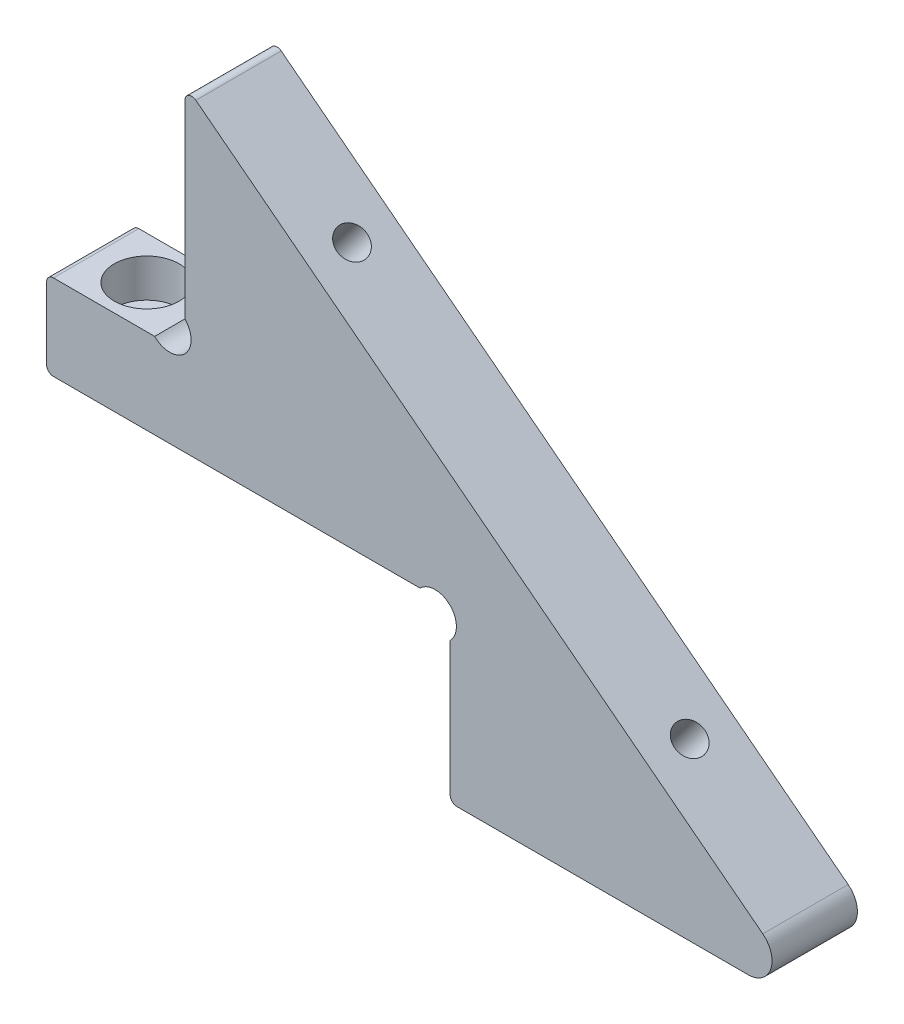
ISO-10303-21;
HEADER;
FILE_DESCRIPTION(('STEP AP214'),'2;1');
FILE_NAME('part.step','',(''),(''),'','','');
FILE_SCHEMA(('AUTOMOTIVE_DESIGN { 1 0 10303 214 1 1 1 1 }'));
ENDSEC;
DATA;
#1=APPLICATION_CONTEXT('core data for automotive mechanical design processes');
#2=APPLICATION_PROTOCOL_DEFINITION('international standard','automotive_design',2000,#1);
#3=PRODUCT_CONTEXT('',#1,'mechanical');
#4=PRODUCT('Part','Part','',(#3));
#5=PRODUCT_RELATED_PRODUCT_CATEGORY('part','',(#4));
#6=PRODUCT_DEFINITION_FORMATION('','',#4);
#7=PRODUCT_DEFINITION_CONTEXT('part definition',#1,'design');
#8=PRODUCT_DEFINITION('design','',#6,#7);
#9=PRODUCT_DEFINITION_SHAPE('','',#8);
#10=(LENGTH_UNIT() NAMED_UNIT(*) SI_UNIT(.MILLI.,.METRE.));
#11=(NAMED_UNIT(*) PLANE_ANGLE_UNIT() SI_UNIT($,.RADIAN.));
#12=(NAMED_UNIT(*) SI_UNIT($,.STERADIAN.) SOLID_ANGLE_UNIT());
#13=UNCERTAINTY_MEASURE_WITH_UNIT(LENGTH_MEASURE(1.E-05),#10,'distance_accuracy_value','');
#14=(GEOMETRIC_REPRESENTATION_CONTEXT(3) GLOBAL_UNCERTAINTY_ASSIGNED_CONTEXT((#13)) GLOBAL_UNIT_ASSIGNED_CONTEXT((#10,
#11,#12)) REPRESENTATION_CONTEXT('',''));
#15=CARTESIAN_POINT('',(0.,0.,0.));
#16=DIRECTION('',(0.,0.,1.));
#17=DIRECTION('',(1.,0.,0.));
#18=AXIS2_PLACEMENT_3D('',#15,#16,#17);
#19=CARTESIAN_POINT('',(-660.683227297424,63.424072949776,6.35));
#20=DIRECTION('',(1.,0.,0.));
#21=DIRECTION('',(0.,0.,-1.));
#22=AXIS2_PLACEMENT_3D('',#19,#20,#21);
#23=PLANE('',#22);
#24=DIRECTION('',(0.,-1.,0.));
#25=VECTOR('',#24,1.);
#26=CARTESIAN_POINT('',(-660.683227297424,63.424072949776,0.));
#27=LINE('',#26,#25);
#28=CARTESIAN_POINT('',(-660.683227297424,73.8789796725458,0.));
#29=VERTEX_POINT('',#28);
#30=CARTESIAN_POINT('',(-660.683227297424,63.932072949776,0.));
#31=VERTEX_POINT('',#30);
#32=EDGE_CURVE('E197',#29,#31,#27,.T.);
#33=ORIENTED_EDGE('',*,*,#32,.T.);
#34=DIRECTION('',(0.,0.,-1.));
#35=VECTOR('',#34,1.);
#36=CARTESIAN_POINT('',(-660.683227297424,63.932072949776,6.35));
#37=LINE('',#36,#35);
#38=CARTESIAN_POINT('',(-660.683227297424,63.932072949776,6.35));
#39=VERTEX_POINT('',#38);
#40=EDGE_CURVE('E247',#31,#39,#37,.F.);
#41=ORIENTED_EDGE('',*,*,#40,.T.);
#42=DIRECTION('',(0.,-1.,0.));
#43=VECTOR('',#42,1.);
#44=CARTESIAN_POINT('',(-660.683227297424,63.424072949776,6.35));
#45=LINE('',#44,#43);
#46=CARTESIAN_POINT('',(-660.683227297424,73.8789796725458,6.35));
#47=VERTEX_POINT('',#46);
#48=EDGE_CURVE('E172',#47,#39,#45,.T.);
#49=ORIENTED_EDGE('',*,*,#48,.F.);
#50=DIRECTION('',(0.,0.,-1.));
#51=VECTOR('',#50,1.);
#52=CARTESIAN_POINT('',(-660.683227297424,73.8789796725458,6.35));
#53=LINE('',#52,#51);
#54=EDGE_CURVE('E196',#47,#29,#53,.T.);
#55=ORIENTED_EDGE('',*,*,#54,.T.);
#56=EDGE_LOOP('',(#33,#41,#49,#55));
#57=FACE_BOUND('',#56,.T.);
#58=ADVANCED_FACE('F35',(#57),#23,.F.);
#59=CARTESIAN_POINT('',(-660.683227297424,63.424072949776,6.35));
#60=DIRECTION('',(0.,1.,0.));
#61=DIRECTION('',(0.,0.,1.));
#62=AXIS2_PLACEMENT_3D('',#59,#60,#61);
#63=PLANE('',#62);
#64=DIRECTION('',(1.,0.,0.));
#65=VECTOR('',#64,1.);
#66=CARTESIAN_POINT('',(-660.683227297424,63.424072949776,6.35));
#67=LINE('',#66,#65);
#68=CARTESIAN_POINT('',(-660.175227297424,63.424072949776,6.35));
#69=VERTEX_POINT('',#68);
#70=CARTESIAN_POINT('',(-638.517578145105,63.424072949776,6.35));
#71=VERTEX_POINT('',#70);
#72=EDGE_CURVE('E175',#69,#71,#67,.T.);
#73=ORIENTED_EDGE('',*,*,#72,.F.);
#74=DIRECTION('',(0.,0.,-1.));
#75=VECTOR('',#74,1.);
#76=CARTESIAN_POINT('',(-660.175227297424,63.424072949776,6.35));
#77=LINE('',#76,#75);
#78=CARTESIAN_POINT('',(-660.175227297424,63.424072949776,0.));
#79=VERTEX_POINT('',#78);
#80=EDGE_CURVE('E236',#69,#79,#77,.T.);
#81=ORIENTED_EDGE('',*,*,#80,.T.);
#82=DIRECTION('',(1.,0.,0.));
#83=VECTOR('',#82,1.);
#84=CARTESIAN_POINT('',(-660.683227297424,63.424072949776,0.));
#85=LINE('',#84,#83);
#86=CARTESIAN_POINT('',(-638.517578145105,63.424072949776,0.));
#87=VERTEX_POINT('',#86);
#88=EDGE_CURVE('E200',#79,#87,#85,.T.);
#89=ORIENTED_EDGE('',*,*,#88,.T.);
#90=DIRECTION('',(0.,0.,-1.));
#91=VECTOR('',#90,1.);
#92=CARTESIAN_POINT('',(-638.517578145105,63.424072949776,6.35));
#93=LINE('',#92,#91);
#94=EDGE_CURVE('E233',#71,#87,#93,.T.);
#95=ORIENTED_EDGE('',*,*,#94,.F.);
#96=EDGE_LOOP('',(#73,#81,#89,#95));
#97=FACE_BOUND('',#96,.T.);
#98=ADVANCED_FACE('F318',(#97),#63,.F.);
#99=CARTESIAN_POINT('',(-638.517578145105,65.1998799549817,6.35));
#100=DIRECTION('',(0.,0.,-1.));
#101=DIRECTION('',(-1.,0.,0.));
#102=AXIS2_PLACEMENT_3D('',#99,#100,#101);
#103=CYLINDRICAL_SURFACE('',#102,1.77580700520582);
#104=CARTESIAN_POINT('',(-638.517578145105,65.1998799549817,0.));
#105=DIRECTION('',(0.,0.,1.));
#106=DIRECTION('',(1.,0.,0.));
#107=AXIS2_PLACEMENT_3D('',#104,#105,#106);
#108=CIRCLE('',#107,1.77580700520582);
#109=CARTESIAN_POINT('',(-637.43127522067,66.6046705002594,0.));
#110=VERTEX_POINT('',#109);
#111=EDGE_CURVE('E202',#87,#110,#108,.T.);
#112=ORIENTED_EDGE('',*,*,#111,.T.);
#113=DIRECTION('',(0.,0.,-1.));
#114=VECTOR('',#113,1.);
#115=CARTESIAN_POINT('',(-637.43127522067,66.6046705002594,6.35));
#116=LINE('',#115,#114);
#117=CARTESIAN_POINT('',(-637.43127522067,66.6046705002594,6.35));
#118=VERTEX_POINT('',#117);
#119=EDGE_CURVE('E230',#118,#110,#116,.T.);
#120=ORIENTED_EDGE('',*,*,#119,.F.);
#121=CARTESIAN_POINT('',(-638.517578145105,65.1998799549817,6.35));
#122=DIRECTION('',(0.,0.,1.));
#123=DIRECTION('',(1.,0.,0.));
#124=AXIS2_PLACEMENT_3D('',#121,#122,#123);
#125=CIRCLE('',#124,1.77580700520582);
#126=EDGE_CURVE('E178',#71,#118,#125,.T.);
#127=ORIENTED_EDGE('',*,*,#126,.F.);
#128=ORIENTED_EDGE('',*,*,#94,.T.);
#129=EDGE_LOOP('',(#112,#120,#127,#128));
#130=FACE_BOUND('',#129,.T.);
#131=ADVANCED_FACE('F323',(#130),#103,.T.);
#132=CARTESIAN_POINT('',(-680.416614026495,99.8445719286819,6.35));
#133=DIRECTION('',(-0.611723526965902,-0.791071631747971,0.));
#134=DIRECTION('',(0.791071631747971,-0.611723526965902,0.));
#135=AXIS2_PLACEMENT_3D('',#132,#133,#134);
#136=PLANE('',#135);
#137=CARTESIAN_POINT('',(-671.158706307309,92.685574266496,3.175));
#138=DIRECTION('',(0.611723526965902,0.791071631747971,0.));
#139=DIRECTION('',(-0.791071631747971,0.611723526965902,0.));
#140=AXIS2_PLACEMENT_3D('',#137,#138,#139);
#141=CIRCLE('',#140,1.13029999999999);
#142=CARTESIAN_POINT('',(-672.052854572674,93.3770053690256,3.175));
#143=VERTEX_POINT('',#142);
#144=EDGE_CURVE('E153',#143,#143,#141,.T.);
#145=ORIENTED_EDGE('',*,*,#144,.F.);
#146=EDGE_LOOP('',(#145));
#147=FACE_BOUND('',#146,.T.);
#148=CARTESIAN_POINT('',(-646.042181999311,73.2633522853287,3.17500000000001));
#149=DIRECTION('',(0.611723526965902,0.791071631747971,0.));
#150=DIRECTION('',(-0.791071631747971,0.611723526965902,0.));
#151=AXIS2_PLACEMENT_3D('',#148,#149,#150);
#152=CIRCLE('',#151,1.13029999999999);
#153=CARTESIAN_POINT('',(-646.936330264676,73.9547833878583,3.17500000000001));
#154=VERTEX_POINT('',#153);
#155=EDGE_CURVE('E152',#154,#154,#152,.T.);
#156=ORIENTED_EDGE('',*,*,#155,.F.);
#157=EDGE_LOOP('',(#156));
#158=FACE_BOUND('',#157,.T.);
#159=DIRECTION('',(-0.791071631747971,0.611723526965902,0.));
#160=VECTOR('',#159,1.);
#161=CARTESIAN_POINT('',(-680.416614026495,99.8445719286819,0.));
#162=LINE('',#161,#160);
#163=CARTESIAN_POINT('',(-679.597858474796,99.2114408521683,0.));
#164=VERTEX_POINT('',#163);
#165=EDGE_CURVE('E204',#110,#164,#162,.T.);
#166=ORIENTED_EDGE('',*,*,#165,.T.);
#167=DIRECTION('',(0.,0.,-1.));
#168=VECTOR('',#167,1.);
#169=CARTESIAN_POINT('',(-679.597858474796,99.2114408521683,6.35));
#170=LINE('',#169,#168);
#171=CARTESIAN_POINT('',(-679.597858474796,99.2114408521683,6.35));
#172=VERTEX_POINT('',#171);
#173=EDGE_CURVE('E11',#164,#172,#170,.F.);
#174=ORIENTED_EDGE('',*,*,#173,.T.);
#175=DIRECTION('',(-0.791071631747971,0.611723526965902,0.));
#176=VECTOR('',#175,1.);
#177=CARTESIAN_POINT('',(-680.416614026495,99.8445719286819,6.35));
#178=LINE('',#177,#176);
#179=EDGE_CURVE('E180',#118,#172,#178,.T.);
#180=ORIENTED_EDGE('',*,*,#179,.F.);
#181=ORIENTED_EDGE('',*,*,#119,.T.);
#182=EDGE_LOOP('',(#166,#174,#180,#181));
#183=FACE_BOUND('',#182,.T.);
#184=ADVANCED_FACE('F327',(#147,#158,#183),#136,.F.);
#185=CARTESIAN_POINT('',(-680.416614026495,99.8445719286819,6.35));
#186=DIRECTION('',(1.,0.,0.));
#187=DIRECTION('',(0.,1.,0.));
#188=AXIS2_PLACEMENT_3D('',#185,#186,#187);
#189=PLANE('',#188);
#190=DIRECTION('',(0.,-1.,0.));
#191=VECTOR('',#190,1.);
#192=CARTESIAN_POINT('',(-680.416614026495,99.8445719286819,6.35));
#193=LINE('',#192,#191);
#194=CARTESIAN_POINT('',(-680.416614026495,98.8095764632403,6.35));
#195=VERTEX_POINT('',#194);
#196=CARTESIAN_POINT('',(-680.416614026495,84.7191077335372,6.35));
#197=VERTEX_POINT('',#196);
#198=EDGE_CURVE('E183',#195,#197,#193,.T.);
#199=ORIENTED_EDGE('',*,*,#198,.F.);
#200=DIRECTION('',(0.,0.,-1.));
#201=VECTOR('',#200,1.);
#202=CARTESIAN_POINT('',(-680.416614026495,98.8095764632403,6.35));
#203=LINE('',#202,#201);
#204=CARTESIAN_POINT('',(-680.416614026495,98.8095764632403,0.));
#205=VERTEX_POINT('',#204);
#206=EDGE_CURVE('E44',#195,#205,#203,.T.);
#207=ORIENTED_EDGE('',*,*,#206,.T.);
#208=DIRECTION('',(0.,-1.,0.));
#209=VECTOR('',#208,1.);
#210=CARTESIAN_POINT('',(-680.416614026495,99.8445719286819,0.));
#211=LINE('',#210,#209);
#212=CARTESIAN_POINT('',(-680.416614026495,84.7191077335372,0.));
#213=VERTEX_POINT('',#212);
#214=EDGE_CURVE('E207',#205,#213,#211,.T.);
#215=ORIENTED_EDGE('',*,*,#214,.T.);
#216=DIRECTION('',(0.,0.,-1.));
#217=VECTOR('',#216,1.);
#218=CARTESIAN_POINT('',(-680.416614026495,84.7191077335372,6.35));
#219=LINE('',#218,#217);
#220=EDGE_CURVE('E227',#197,#213,#219,.T.);
#221=ORIENTED_EDGE('',*,*,#220,.F.);
#222=EDGE_LOOP('',(#199,#207,#215,#221));
#223=FACE_BOUND('',#222,.T.);
#224=ADVANCED_FACE('F270',(#223),#189,.F.);
#225=CARTESIAN_POINT('',(-681.539146041629,83.5965757184037,6.35));
#226=DIRECTION('',(0.,0.,-1.));
#227=DIRECTION('',(-1.,0.,0.));
#228=AXIS2_PLACEMENT_3D('',#225,#226,#227);
#229=CYLINDRICAL_SURFACE('',#228,1.58749999999999);
#230=CARTESIAN_POINT('',(-681.539146041629,83.5965757184037,0.));
#231=DIRECTION('',(0.,0.,-1.));
#232=DIRECTION('',(1.,0.,0.));
#233=AXIS2_PLACEMENT_3D('',#230,#231,#232);
#234=CIRCLE('',#233,1.58749999999999);
#235=CARTESIAN_POINT('',(-682.661678056762,82.4740437032701,0.));
#236=VERTEX_POINT('',#235);
#237=EDGE_CURVE('E209',#213,#236,#234,.T.);
#238=ORIENTED_EDGE('',*,*,#237,.T.);
#239=DIRECTION('',(0.,0.,-1.));
#240=VECTOR('',#239,1.);
#241=CARTESIAN_POINT('',(-682.661678056762,82.4740437032701,6.35));
#242=LINE('',#241,#240);
#243=CARTESIAN_POINT('',(-682.661678056762,82.4740437032701,6.35));
#244=VERTEX_POINT('',#243);
#245=EDGE_CURVE('E224',#244,#236,#242,.T.);
#246=ORIENTED_EDGE('',*,*,#245,.F.);
#247=CARTESIAN_POINT('',(-681.539146041629,83.5965757184037,6.35));
#248=DIRECTION('',(0.,0.,-1.));
#249=DIRECTION('',(1.,0.,0.));
#250=AXIS2_PLACEMENT_3D('',#247,#248,#249);
#251=CIRCLE('',#250,1.58749999999999);
#252=EDGE_CURVE('E185',#197,#244,#251,.T.);
#253=ORIENTED_EDGE('',*,*,#252,.F.);
#254=ORIENTED_EDGE('',*,*,#220,.T.);
#255=EDGE_LOOP('',(#238,#246,#253,#254));
#256=FACE_BOUND('',#255,.T.);
#257=ADVANCED_FACE('F282',(#256),#229,.F.);
#258=CARTESIAN_POINT('',(-690.700357041726,82.4740437032701,6.35));
#259=DIRECTION('',(0.,-1.,0.));
#260=DIRECTION('',(1.,0.,0.));
#261=AXIS2_PLACEMENT_3D('',#258,#259,#260);
#262=PLANE('',#261);
#263=CARTESIAN_POINT('',(-686.427017549244,82.4740437032701,3.175));
#264=DIRECTION('',(0.,1.,0.));
#265=DIRECTION('',(0.,0.,1.));
#266=AXIS2_PLACEMENT_3D('',#263,#264,#265);
#267=CIRCLE('',#266,2.413);
#268=CARTESIAN_POINT('',(-686.427017549244,82.4740437032701,5.588));
#269=VERTEX_POINT('',#268);
#270=EDGE_CURVE('E163',#269,#269,#267,.T.);
#271=ORIENTED_EDGE('',*,*,#270,.F.);
#272=EDGE_LOOP('',(#271));
#273=FACE_BOUND('',#272,.T.);
#274=DIRECTION('',(-1.,0.,0.));
#275=VECTOR('',#274,1.);
#276=CARTESIAN_POINT('',(-690.700357041726,82.4740437032701,0.));
#277=LINE('',#276,#275);
#278=CARTESIAN_POINT('',(-690.192357041726,82.4740437032701,0.));
#279=VERTEX_POINT('',#278);
#280=EDGE_CURVE('E211',#236,#279,#277,.T.);
#281=ORIENTED_EDGE('',*,*,#280,.T.);
#282=DIRECTION('',(0.,0.,-1.));
#283=VECTOR('',#282,1.);
#284=CARTESIAN_POINT('',(-690.192357041726,82.4740437032701,6.35));
#285=LINE('',#284,#283);
#286=CARTESIAN_POINT('',(-690.192357041726,82.4740437032701,6.35));
#287=VERTEX_POINT('',#286);
#288=EDGE_CURVE('E263',#279,#287,#285,.F.);
#289=ORIENTED_EDGE('',*,*,#288,.T.);
#290=DIRECTION('',(-1.,0.,0.));
#291=VECTOR('',#290,1.);
#292=CARTESIAN_POINT('',(-690.700357041726,82.4740437032701,6.35));
#293=LINE('',#292,#291);
#294=EDGE_CURVE('E187',#244,#287,#293,.T.);
#295=ORIENTED_EDGE('',*,*,#294,.F.);
#296=ORIENTED_EDGE('',*,*,#245,.T.);
#297=EDGE_LOOP('',(#281,#289,#295,#296));
#298=FACE_BOUND('',#297,.T.);
#299=ADVANCED_FACE('F286',(#273,#298),#262,.F.);
#300=CARTESIAN_POINT('',(-690.700357041726,82.4740437032701,6.35));
#301=DIRECTION('',(1.,0.,0.));
#302=DIRECTION('',(0.,1.,0.));
#303=AXIS2_PLACEMENT_3D('',#300,#301,#302);
#304=PLANE('',#303);
#305=DIRECTION('',(0.,-1.,0.));
#306=VECTOR('',#305,1.);
#307=CARTESIAN_POINT('',(-690.700357041726,82.4740437032701,0.));
#308=LINE('',#307,#306);
#309=CARTESIAN_POINT('',(-690.700357041726,81.9660437032701,0.));
#310=VERTEX_POINT('',#309);
#311=CARTESIAN_POINT('',(-690.700357041726,76.632043702813,0.));
#312=VERTEX_POINT('',#311);
#313=EDGE_CURVE('E214',#310,#312,#308,.T.);
#314=ORIENTED_EDGE('',*,*,#313,.T.);
#315=DIRECTION('',(0.,0.,-1.));
#316=VECTOR('',#315,1.);
#317=CARTESIAN_POINT('',(-690.700357041726,76.632043702813,6.35));
#318=LINE('',#317,#316);
#319=CARTESIAN_POINT('',(-690.700357041726,76.632043702813,6.35));
#320=VERTEX_POINT('',#319);
#321=EDGE_CURVE('E59',#312,#320,#318,.F.);
#322=ORIENTED_EDGE('',*,*,#321,.T.);
#323=DIRECTION('',(0.,-1.,0.));
#324=VECTOR('',#323,1.);
#325=CARTESIAN_POINT('',(-690.700357041726,82.4740437032701,6.35));
#326=LINE('',#325,#324);
#327=CARTESIAN_POINT('',(-690.700357041726,81.9660437032701,6.35));
#328=VERTEX_POINT('',#327);
#329=EDGE_CURVE('E190',#328,#320,#326,.T.);
#330=ORIENTED_EDGE('',*,*,#329,.F.);
#331=DIRECTION('',(0.,0.,-1.));
#332=VECTOR('',#331,1.);
#333=CARTESIAN_POINT('',(-690.700357041726,81.9660437032701,6.35));
#334=LINE('',#333,#332);
#335=EDGE_CURVE('E259',#328,#310,#334,.T.);
#336=ORIENTED_EDGE('',*,*,#335,.T.);
#337=EDGE_LOOP('',(#314,#322,#330,#336));
#338=FACE_BOUND('',#337,.T.);
#339=ADVANCED_FACE('F294',(#338),#304,.F.);
#340=CARTESIAN_POINT('',(-662.928291327691,76.124043702813,6.35));
#341=DIRECTION('',(0.,1.,0.));
#342=DIRECTION('',(-1.,0.,0.));
#343=AXIS2_PLACEMENT_3D('',#340,#341,#342);
#344=PLANE('',#343);
#345=CARTESIAN_POINT('',(-686.427017549244,76.124043702813,3.175));
#346=DIRECTION('',(0.,1.,0.));
#347=DIRECTION('',(-1.,0.,0.));
#348=AXIS2_PLACEMENT_3D('',#345,#346,#347);
#349=CIRCLE('',#348,1.47319999999995);
#350=CARTESIAN_POINT('',(-687.900217549244,76.124043702813,3.175));
#351=VERTEX_POINT('',#350);
#352=EDGE_CURVE('E39',#351,#351,#349,.T.);
#353=ORIENTED_EDGE('',*,*,#352,.T.);
#354=EDGE_LOOP('',(#353));
#355=FACE_BOUND('',#354,.T.);
#356=DIRECTION('',(1.,0.,0.));
#357=VECTOR('',#356,1.);
#358=CARTESIAN_POINT('',(-662.928291327691,76.124043702813,6.35));
#359=LINE('',#358,#357);
#360=CARTESIAN_POINT('',(-690.192357041726,76.124043702813,6.35));
#361=VERTEX_POINT('',#360);
#362=CARTESIAN_POINT('',(-662.928291327691,76.124043702813,6.35));
#363=VERTEX_POINT('',#362);
#364=EDGE_CURVE('E192',#361,#363,#359,.T.);
#365=ORIENTED_EDGE('',*,*,#364,.F.);
#366=DIRECTION('',(0.,0.,-1.));
#367=VECTOR('',#366,1.);
#368=CARTESIAN_POINT('',(-690.192357041726,76.124043702813,6.35));
#369=LINE('',#368,#367);
#370=CARTESIAN_POINT('',(-690.192357041726,76.124043702813,0.));
#371=VERTEX_POINT('',#370);
#372=EDGE_CURVE('E256',#361,#371,#369,.T.);
#373=ORIENTED_EDGE('',*,*,#372,.T.);
#374=DIRECTION('',(1.,0.,0.));
#375=VECTOR('',#374,1.);
#376=CARTESIAN_POINT('',(-662.928291327691,76.124043702813,0.));
#377=LINE('',#376,#375);
#378=CARTESIAN_POINT('',(-662.928291327691,76.124043702813,0.));
#379=VERTEX_POINT('',#378);
#380=EDGE_CURVE('E216',#371,#379,#377,.T.);
#381=ORIENTED_EDGE('',*,*,#380,.T.);
#382=DIRECTION('',(0.,0.,-1.));
#383=VECTOR('',#382,1.);
#384=CARTESIAN_POINT('',(-662.928291327691,76.124043702813,6.35));
#385=LINE('',#384,#383);
#386=EDGE_CURVE('E221',#363,#379,#385,.T.);
#387=ORIENTED_EDGE('',*,*,#386,.F.);
#388=EDGE_LOOP('',(#365,#373,#381,#387));
#389=FACE_BOUND('',#388,.T.);
#390=ADVANCED_FACE('F301',(#355,#389),#344,.F.);
#391=CARTESIAN_POINT('',(-661.805759312558,75.0015116876794,6.35));
#392=DIRECTION('',(0.,0.,-1.));
#393=DIRECTION('',(-1.,0.,0.));
#394=AXIS2_PLACEMENT_3D('',#391,#392,#393);
#395=CYLINDRICAL_SURFACE('',#394,1.58749999999994);
#396=CARTESIAN_POINT('',(-661.805759312558,75.0015116876794,0.));
#397=DIRECTION('',(0.,0.,-1.));
#398=DIRECTION('',(1.,0.,0.));
#399=AXIS2_PLACEMENT_3D('',#396,#397,#398);
#400=CIRCLE('',#399,1.58749999999994);
#401=EDGE_CURVE('E176',#379,#29,#400,.T.);
#402=ORIENTED_EDGE('',*,*,#401,.T.);
#403=ORIENTED_EDGE('',*,*,#54,.F.);
#404=CARTESIAN_POINT('',(-661.805759312558,75.0015116876794,6.35));
#405=DIRECTION('',(0.,0.,-1.));
#406=DIRECTION('',(1.,0.,0.));
#407=AXIS2_PLACEMENT_3D('',#404,#405,#406);
#408=CIRCLE('',#407,1.58749999999994);
#409=EDGE_CURVE('E194',#363,#47,#408,.T.);
#410=ORIENTED_EDGE('',*,*,#409,.F.);
#411=ORIENTED_EDGE('',*,*,#386,.T.);
#412=EDGE_LOOP('',(#402,#403,#410,#411));
#413=FACE_BOUND('',#412,.T.);
#414=ADVANCED_FACE('F308',(#413),#395,.F.);
#415=CARTESIAN_POINT('',(-661.805759312558,75.0015116876794,6.35));
#416=DIRECTION('',(0.,0.,1.));
#417=DIRECTION('',(1.,0.,0.));
#418=AXIS2_PLACEMENT_3D('',#415,#416,#417);
#419=PLANE('',#418);
#420=ORIENTED_EDGE('',*,*,#48,.T.);
#421=CARTESIAN_POINT('',(-660.175227297424,63.932072949776,6.35));
#422=DIRECTION('',(0.,0.,1.));
#423=DIRECTION('',(1.,0.,0.));
#424=AXIS2_PLACEMENT_3D('',#421,#422,#423);
#425=CIRCLE('',#424,0.508);
#426=EDGE_CURVE('E254',#39,#69,#425,.T.);
#427=ORIENTED_EDGE('',*,*,#426,.T.);
#428=ORIENTED_EDGE('',*,*,#72,.T.);
#429=ORIENTED_EDGE('',*,*,#126,.T.);
#430=ORIENTED_EDGE('',*,*,#179,.T.);
#431=CARTESIAN_POINT('',(-679.908614026495,98.8095764632403,6.35));
#432=DIRECTION('',(0.,0.,1.));
#433=DIRECTION('',(1.,0.,0.));
#434=AXIS2_PLACEMENT_3D('',#431,#432,#433);
#435=CIRCLE('',#434,0.508);
#436=EDGE_CURVE('E249',#172,#195,#435,.T.);
#437=ORIENTED_EDGE('',*,*,#436,.T.);
#438=ORIENTED_EDGE('',*,*,#198,.T.);
#439=ORIENTED_EDGE('',*,*,#252,.T.);
#440=ORIENTED_EDGE('',*,*,#294,.T.);
#441=CARTESIAN_POINT('',(-690.192357041726,81.9660437032701,6.35));
#442=DIRECTION('',(0.,0.,1.));
#443=DIRECTION('',(1.,0.,0.));
#444=AXIS2_PLACEMENT_3D('',#441,#442,#443);
#445=CIRCLE('',#444,0.508);
#446=EDGE_CURVE('E251',#287,#328,#445,.T.);
#447=ORIENTED_EDGE('',*,*,#446,.T.);
#448=ORIENTED_EDGE('',*,*,#329,.T.);
#449=CARTESIAN_POINT('',(-690.192357041726,76.632043702813,6.35));
#450=DIRECTION('',(0.,0.,1.));
#451=DIRECTION('',(1.,0.,0.));
#452=AXIS2_PLACEMENT_3D('',#449,#450,#451);
#453=CIRCLE('',#452,0.508);
#454=EDGE_CURVE('E51',#320,#361,#453,.T.);
#455=ORIENTED_EDGE('',*,*,#454,.T.);
#456=ORIENTED_EDGE('',*,*,#364,.T.);
#457=ORIENTED_EDGE('',*,*,#409,.T.);
#458=EDGE_LOOP('',(#420,#427,#428,#429,#430,#437,#438,#439,#440,#447,#448,#455,#456,#457));
#459=FACE_BOUND('',#458,.T.);
#460=ADVANCED_FACE('F289',(#459),#419,.T.);
#461=CARTESIAN_POINT('',(-661.805759312558,75.0015116876794,0.));
#462=DIRECTION('',(0.,0.,1.));
#463=DIRECTION('',(1.,0.,0.));
#464=AXIS2_PLACEMENT_3D('',#461,#462,#463);
#465=PLANE('',#464);
#466=ORIENTED_EDGE('',*,*,#88,.F.);
#467=CARTESIAN_POINT('',(-660.175227297424,63.932072949776,0.));
#468=DIRECTION('',(0.,0.,1.));
#469=DIRECTION('',(1.,0.,0.));
#470=AXIS2_PLACEMENT_3D('',#467,#468,#469);
#471=CIRCLE('',#470,0.508);
#472=EDGE_CURVE('E245',#79,#31,#471,.F.);
#473=ORIENTED_EDGE('',*,*,#472,.T.);
#474=ORIENTED_EDGE('',*,*,#32,.F.);
#475=ORIENTED_EDGE('',*,*,#401,.F.);
#476=ORIENTED_EDGE('',*,*,#380,.F.);
#477=CARTESIAN_POINT('',(-690.192357041726,76.632043702813,0.));
#478=DIRECTION('',(0.,0.,1.));
#479=DIRECTION('',(1.,0.,0.));
#480=AXIS2_PLACEMENT_3D('',#477,#478,#479);
#481=CIRCLE('',#480,0.508);
#482=EDGE_CURVE('E243',#371,#312,#481,.F.);
#483=ORIENTED_EDGE('',*,*,#482,.T.);
#484=ORIENTED_EDGE('',*,*,#313,.F.);
#485=CARTESIAN_POINT('',(-690.192357041726,81.9660437032701,0.));
#486=DIRECTION('',(0.,0.,1.));
#487=DIRECTION('',(1.,0.,0.));
#488=AXIS2_PLACEMENT_3D('',#485,#486,#487);
#489=CIRCLE('',#488,0.508);
#490=EDGE_CURVE('E241',#310,#279,#489,.F.);
#491=ORIENTED_EDGE('',*,*,#490,.T.);
#492=ORIENTED_EDGE('',*,*,#280,.F.);
#493=ORIENTED_EDGE('',*,*,#237,.F.);
#494=ORIENTED_EDGE('',*,*,#214,.F.);
#495=CARTESIAN_POINT('',(-679.908614026495,98.8095764632403,0.));
#496=DIRECTION('',(0.,0.,1.));
#497=DIRECTION('',(1.,0.,0.));
#498=AXIS2_PLACEMENT_3D('',#495,#496,#497);
#499=CIRCLE('',#498,0.508);
#500=EDGE_CURVE('E239',#205,#164,#499,.F.);
#501=ORIENTED_EDGE('',*,*,#500,.T.);
#502=ORIENTED_EDGE('',*,*,#165,.F.);
#503=ORIENTED_EDGE('',*,*,#111,.F.);
#504=EDGE_LOOP('',(#466,#473,#474,#475,#476,#483,#484,#491,#492,#493,#494,#501,#502,#503));
#505=FACE_BOUND('',#504,.T.);
#506=ADVANCED_FACE('F277',(#505),#465,.F.);
#507=CARTESIAN_POINT('',(-660.175227297424,63.932072949776,6.35));
#508=DIRECTION('',(0.,0.,-1.));
#509=DIRECTION('',(-1.,0.,0.));
#510=AXIS2_PLACEMENT_3D('',#507,#508,#509);
#511=CYLINDRICAL_SURFACE('',#510,0.508);
#512=ORIENTED_EDGE('',*,*,#426,.F.);
#513=ORIENTED_EDGE('',*,*,#40,.F.);
#514=ORIENTED_EDGE('',*,*,#472,.F.);
#515=ORIENTED_EDGE('',*,*,#80,.F.);
#516=EDGE_LOOP('',(#512,#513,#514,#515));
#517=FACE_BOUND('',#516,.T.);
#518=ADVANCED_FACE('F313',(#517),#511,.T.);
#519=CARTESIAN_POINT('',(-690.192357041726,76.632043702813,6.35));
#520=DIRECTION('',(0.,0.,-1.));
#521=DIRECTION('',(-1.,0.,0.));
#522=AXIS2_PLACEMENT_3D('',#519,#520,#521);
#523=CYLINDRICAL_SURFACE('',#522,0.508);
#524=ORIENTED_EDGE('',*,*,#454,.F.);
#525=ORIENTED_EDGE('',*,*,#321,.F.);
#526=ORIENTED_EDGE('',*,*,#482,.F.);
#527=ORIENTED_EDGE('',*,*,#372,.F.);
#528=EDGE_LOOP('',(#524,#525,#526,#527));
#529=FACE_BOUND('',#528,.T.);
#530=ADVANCED_FACE('F299',(#529),#523,.T.);
#531=CARTESIAN_POINT('',(-690.192357041726,81.9660437032701,6.35));
#532=DIRECTION('',(0.,0.,-1.));
#533=DIRECTION('',(-1.,0.,0.));
#534=AXIS2_PLACEMENT_3D('',#531,#532,#533);
#535=CYLINDRICAL_SURFACE('',#534,0.508);
#536=ORIENTED_EDGE('',*,*,#446,.F.);
#537=ORIENTED_EDGE('',*,*,#288,.F.);
#538=ORIENTED_EDGE('',*,*,#490,.F.);
#539=ORIENTED_EDGE('',*,*,#335,.F.);
#540=EDGE_LOOP('',(#536,#537,#538,#539));
#541=FACE_BOUND('',#540,.T.);
#542=ADVANCED_FACE('F292',(#541),#535,.T.);
#543=CARTESIAN_POINT('',(-679.908614026495,98.8095764632403,6.35));
#544=DIRECTION('',(0.,0.,-1.));
#545=DIRECTION('',(-1.,0.,0.));
#546=AXIS2_PLACEMENT_3D('',#543,#544,#545);
#547=CYLINDRICAL_SURFACE('',#546,0.508);
#548=ORIENTED_EDGE('',*,*,#436,.F.);
#549=ORIENTED_EDGE('',*,*,#173,.F.);
#550=ORIENTED_EDGE('',*,*,#500,.F.);
#551=ORIENTED_EDGE('',*,*,#206,.F.);
#552=EDGE_LOOP('',(#548,#549,#550,#551));
#553=FACE_BOUND('',#552,.T.);
#554=ADVANCED_FACE('F37',(#553),#547,.T.);
#555=CARTESIAN_POINT('',(-686.427017549244,82.4740437032701,3.175));
#556=DIRECTION('',(0.,1.,0.));
#557=DIRECTION('',(0.,0.,1.));
#558=AXIS2_PLACEMENT_3D('',#555,#556,#557);
#559=CYLINDRICAL_SURFACE('',#558,1.47319999999995);
#560=CARTESIAN_POINT('',(-686.427017549244,79.6292437032701,3.175));
#561=DIRECTION('',(0.,1.,0.));
#562=DIRECTION('',(0.,0.,1.));
#563=AXIS2_PLACEMENT_3D('',#560,#561,#562);
#564=CIRCLE('',#563,1.47319999999995);
#565=CARTESIAN_POINT('',(-686.427017549244,79.6292437032701,4.64819999999995));
#566=VERTEX_POINT('',#565);
#567=EDGE_CURVE('E169',#566,#566,#564,.T.);
#568=ORIENTED_EDGE('',*,*,#567,.T.);
#569=EDGE_LOOP('',(#568));
#570=FACE_BOUND('',#569,.T.);
#571=ORIENTED_EDGE('',*,*,#352,.F.);
#572=EDGE_LOOP('',(#571));
#573=FACE_BOUND('',#572,.T.);
#574=ADVANCED_FACE('F353',(#570,#573),#559,.F.);
#575=CARTESIAN_POINT('',(-684.953817549244,79.6292437032701,3.175));
#576=DIRECTION('',(0.,-1.,0.));
#577=DIRECTION('',(0.,0.,-1.));
#578=AXIS2_PLACEMENT_3D('',#575,#576,#577);
#579=PLANE('',#578);
#580=ORIENTED_EDGE('',*,*,#567,.F.);
#581=EDGE_LOOP('',(#580));
#582=FACE_BOUND('',#581,.T.);
#583=CARTESIAN_POINT('',(-686.427017549244,79.6292437032701,3.175));
#584=DIRECTION('',(0.,1.,0.));
#585=DIRECTION('',(0.,0.,1.));
#586=AXIS2_PLACEMENT_3D('',#583,#584,#585);
#587=CIRCLE('',#586,2.413);
#588=CARTESIAN_POINT('',(-686.427017549244,79.6292437032701,5.588));
#589=VERTEX_POINT('',#588);
#590=EDGE_CURVE('E166',#589,#589,#587,.T.);
#591=ORIENTED_EDGE('',*,*,#590,.T.);
#592=EDGE_LOOP('',(#591));
#593=FACE_BOUND('',#592,.T.);
#594=ADVANCED_FACE('F357',(#582,#593),#579,.F.);
#595=CARTESIAN_POINT('',(-686.427017549244,82.4740437032701,3.175));
#596=DIRECTION('',(0.,1.,0.));
#597=DIRECTION('',(0.,0.,1.));
#598=AXIS2_PLACEMENT_3D('',#595,#596,#597);
#599=CYLINDRICAL_SURFACE('',#598,2.413);
#600=ORIENTED_EDGE('',*,*,#590,.F.);
#601=EDGE_LOOP('',(#600));
#602=FACE_BOUND('',#601,.T.);
#603=ORIENTED_EDGE('',*,*,#270,.T.);
#604=EDGE_LOOP('',(#603));
#605=FACE_BOUND('',#604,.T.);
#606=ADVANCED_FACE('F363',(#602,#605),#599,.F.);
#607=CARTESIAN_POINT('',(-650.543189874551,67.4427168390557,3.17500000000001));
#608=DIRECTION('',(0.611723526965902,0.791071631747971,0.));
#609=DIRECTION('',(-0.791071631747971,0.611723526965902,0.));
#610=AXIS2_PLACEMENT_3D('',#607,#608,#609);
#611=CONICAL_SURFACE('',#610,1.1303,1.02974425867663);
#612=CARTESIAN_POINT('',(-650.958643594832,66.9054583588263,3.175));
#613=VERTEX_POINT('',#612);
#614=VERTEX_LOOP('',#613);
#615=FACE_BOUND('',#614,.T.);
#616=CARTESIAN_POINT('',(-650.543189874551,67.4427168390557,3.17500000000001));
#617=DIRECTION('',(0.611723526965902,0.791071631747971,0.));
#618=DIRECTION('',(-0.791071631747971,0.611723526965902,0.));
#619=AXIS2_PLACEMENT_3D('',#616,#617,#618);
#620=CIRCLE('',#619,1.1303);
#621=CARTESIAN_POINT('',(-651.437338139916,68.1341479415853,3.17500000000001));
#622=VERTEX_POINT('',#621);
#623=EDGE_CURVE('E156',#622,#622,#620,.T.);
#624=ORIENTED_EDGE('',*,*,#623,.T.);
#625=EDGE_LOOP('',(#624));
#626=FACE_BOUND('',#625,.T.);
#627=ADVANCED_FACE('F449',(#615,#626),#611,.F.);
#628=CARTESIAN_POINT('',(-646.042181999311,73.2633522853287,3.17500000000001));
#629=DIRECTION('',(0.611723526965902,0.791071631747971,0.));
#630=DIRECTION('',(-0.791071631747971,0.611723526965902,0.));
#631=AXIS2_PLACEMENT_3D('',#628,#629,#630);
#632=CYLINDRICAL_SURFACE('',#631,1.13029999999999);
#633=ORIENTED_EDGE('',*,*,#623,.F.);
#634=EDGE_LOOP('',(#633));
#635=FACE_BOUND('',#634,.T.);
#636=ORIENTED_EDGE('',*,*,#155,.T.);
#637=EDGE_LOOP('',(#636));
#638=FACE_BOUND('',#637,.T.);
#639=ADVANCED_FACE('F146',(#635,#638),#632,.F.);
#640=CARTESIAN_POINT('',(-676.1965944005,86.1706534260122,3.175));
#641=DIRECTION('',(0.611723526965902,0.791071631747971,0.));
#642=DIRECTION('',(-0.791071631747971,0.611723526965902,0.));
#643=AXIS2_PLACEMENT_3D('',#640,#641,#642);
#644=CONICAL_SURFACE('',#643,1.1303,1.02974425867663);
#645=CARTESIAN_POINT('',(-676.612048120781,85.6333949457827,3.175));
#646=VERTEX_POINT('',#645);
#647=VERTEX_LOOP('',#646);
#648=FACE_BOUND('',#647,.T.);
#649=CARTESIAN_POINT('',(-676.1965944005,86.1706534260122,3.175));
#650=DIRECTION('',(0.611723526965902,0.791071631747971,0.));
#651=DIRECTION('',(-0.791071631747971,0.611723526965902,0.));
#652=AXIS2_PLACEMENT_3D('',#649,#650,#651);
#653=CIRCLE('',#652,1.1303);
#654=CARTESIAN_POINT('',(-677.090742665865,86.8620845285418,3.175));
#655=VERTEX_POINT('',#654);
#656=EDGE_CURVE('E150',#655,#655,#653,.T.);
#657=ORIENTED_EDGE('',*,*,#656,.T.);
#658=EDGE_LOOP('',(#657));
#659=FACE_BOUND('',#658,.T.);
#660=ADVANCED_FACE('F142',(#648,#659),#644,.F.);
#661=CARTESIAN_POINT('',(-671.158706307309,92.685574266496,3.175));
#662=DIRECTION('',(0.611723526965902,0.791071631747971,0.));
#663=DIRECTION('',(-0.791071631747971,0.611723526965902,0.));
#664=AXIS2_PLACEMENT_3D('',#661,#662,#663);
#665=CYLINDRICAL_SURFACE('',#664,1.13029999999999);
#666=ORIENTED_EDGE('',*,*,#656,.F.);
#667=EDGE_LOOP('',(#666));
#668=FACE_BOUND('',#667,.T.);
#669=ORIENTED_EDGE('',*,*,#144,.T.);
#670=EDGE_LOOP('',(#669));
#671=FACE_BOUND('',#670,.T.);
#672=ADVANCED_FACE('F145',(#668,#671),#665,.F.);
#673=CLOSED_SHELL('',(#58,#98,#131,#184,#224,#257,#299,#339,#390,#414,#460,#506,#518,#530,#542,
#554,#574,#594,#606,#627,#639,#660,#672));
#674=MANIFOLD_SOLID_BREP('B2',#673);
#675=ADVANCED_BREP_SHAPE_REPRESENTATION('',(#18,#674),#14);
#676=SHAPE_DEFINITION_REPRESENTATION(#9,#675);
ENDSEC;
END-ISO-10303-21;
